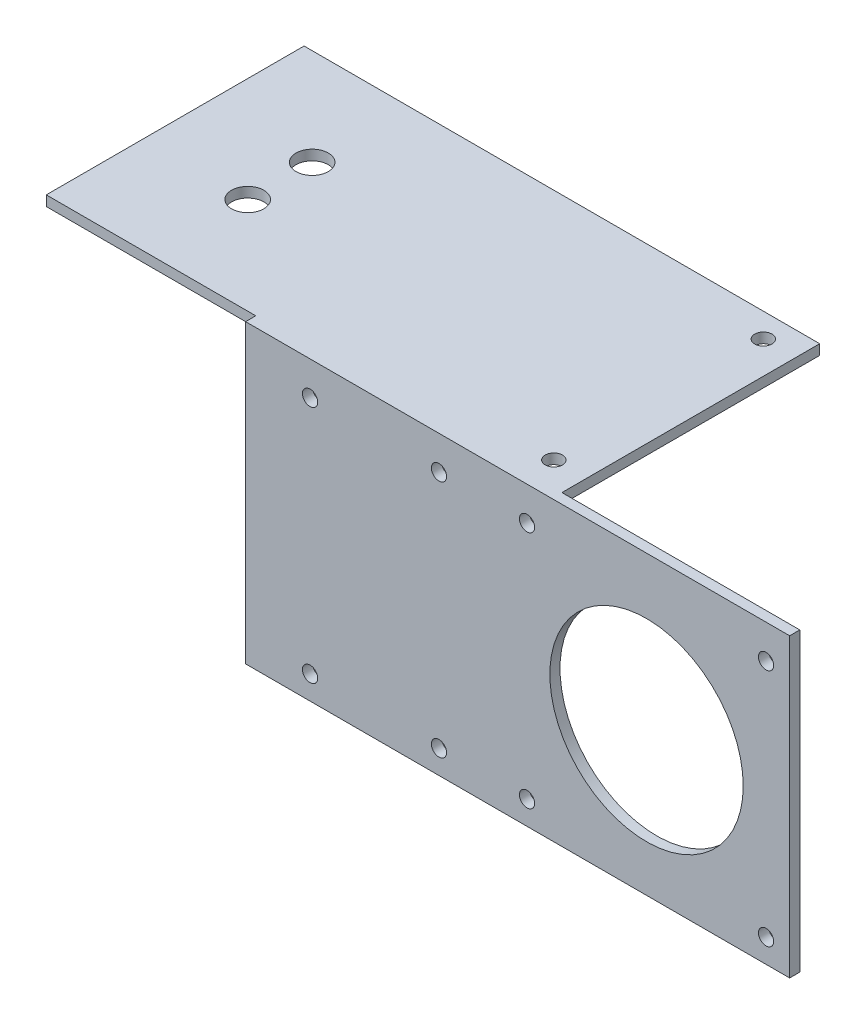
ISO-10303-21;
HEADER;
FILE_DESCRIPTION(('STEP AP214'),'2;1');
FILE_NAME('part.step','',(''),(''),'','','');
FILE_SCHEMA(('AUTOMOTIVE_DESIGN { 1 0 10303 214 1 1 1 1 }'));
ENDSEC;
DATA;
#1=APPLICATION_CONTEXT('core data for automotive mechanical design processes');
#2=APPLICATION_PROTOCOL_DEFINITION('international standard','automotive_design',2000,#1);
#3=PRODUCT_CONTEXT('',#1,'mechanical');
#4=PRODUCT('Part','Part','',(#3));
#5=PRODUCT_RELATED_PRODUCT_CATEGORY('part','',(#4));
#6=PRODUCT_DEFINITION_FORMATION('','',#4);
#7=PRODUCT_DEFINITION_CONTEXT('part definition',#1,'design');
#8=PRODUCT_DEFINITION('design','',#6,#7);
#9=PRODUCT_DEFINITION_SHAPE('','',#8);
#10=(LENGTH_UNIT() NAMED_UNIT(*) SI_UNIT(.MILLI.,.METRE.));
#11=(NAMED_UNIT(*) PLANE_ANGLE_UNIT() SI_UNIT($,.RADIAN.));
#12=(NAMED_UNIT(*) SI_UNIT($,.STERADIAN.) SOLID_ANGLE_UNIT());
#13=UNCERTAINTY_MEASURE_WITH_UNIT(LENGTH_MEASURE(1.E-05),#10,'distance_accuracy_value','');
#14=(GEOMETRIC_REPRESENTATION_CONTEXT(3) GLOBAL_UNCERTAINTY_ASSIGNED_CONTEXT((#13)) GLOBAL_UNIT_ASSIGNED_CONTEXT((#10,
#11,#12)) REPRESENTATION_CONTEXT('',''));
#15=CARTESIAN_POINT('',(0.,0.,0.));
#16=DIRECTION('',(0.,0.,1.));
#17=DIRECTION('',(1.,0.,0.));
#18=AXIS2_PLACEMENT_3D('',#15,#16,#17);
#19=CARTESIAN_POINT('',(0.,0.,-2.));
#20=DIRECTION('',(0.,0.,1.));
#21=DIRECTION('',(1.,0.,0.));
#22=AXIS2_PLACEMENT_3D('',#19,#20,#21);
#23=PLANE('',#22);
#24=CARTESIAN_POINT('',(102.55,51.75,-2.));
#25=DIRECTION('',(0.,0.,1.));
#26=DIRECTION('',(1.,0.,0.));
#27=AXIS2_PLACEMENT_3D('',#24,#25,#26);
#28=CIRCLE('',#27,1.5);
#29=CARTESIAN_POINT('',(104.05,51.75,-2.));
#30=VERTEX_POINT('',#29);
#31=EDGE_CURVE('E197',#30,#30,#28,.T.);
#32=ORIENTED_EDGE('',*,*,#31,.T.);
#33=EDGE_LOOP('',(#32));
#34=FACE_BOUND('',#33,.T.);
#35=CARTESIAN_POINT('',(102.55,4.64999999999999,-2.));
#36=DIRECTION('',(0.,0.,1.));
#37=DIRECTION('',(1.,0.,0.));
#38=AXIS2_PLACEMENT_3D('',#35,#36,#37);
#39=CIRCLE('',#38,1.5);
#40=CARTESIAN_POINT('',(104.05,4.64999999999999,-2.));
#41=VERTEX_POINT('',#40);
#42=EDGE_CURVE('E191',#41,#41,#39,.T.);
#43=ORIENTED_EDGE('',*,*,#42,.T.);
#44=EDGE_LOOP('',(#43));
#45=FACE_BOUND('',#44,.T.);
#46=CARTESIAN_POINT('',(55.45,4.64999999999999,-2.));
#47=DIRECTION('',(0.,0.,1.));
#48=DIRECTION('',(1.,0.,0.));
#49=AXIS2_PLACEMENT_3D('',#46,#47,#48);
#50=CIRCLE('',#49,1.5);
#51=CARTESIAN_POINT('',(56.95,4.64999999999999,-2.));
#52=VERTEX_POINT('',#51);
#53=EDGE_CURVE('E185',#52,#52,#50,.T.);
#54=ORIENTED_EDGE('',*,*,#53,.T.);
#55=EDGE_LOOP('',(#54));
#56=FACE_BOUND('',#55,.T.);
#57=CARTESIAN_POINT('',(55.45,51.75,-2.));
#58=DIRECTION('',(0.,0.,1.));
#59=DIRECTION('',(1.,0.,0.));
#60=AXIS2_PLACEMENT_3D('',#57,#58,#59);
#61=CIRCLE('',#60,1.5);
#62=CARTESIAN_POINT('',(56.95,51.75,-2.));
#63=VERTEX_POINT('',#62);
#64=EDGE_CURVE('E179',#63,#63,#61,.T.);
#65=ORIENTED_EDGE('',*,*,#64,.T.);
#66=EDGE_LOOP('',(#65));
#67=FACE_BOUND('',#66,.T.);
#68=CARTESIAN_POINT('',(12.7,51.75,-2.));
#69=DIRECTION('',(0.,0.,1.));
#70=DIRECTION('',(1.,0.,0.));
#71=AXIS2_PLACEMENT_3D('',#68,#69,#70);
#72=CIRCLE('',#71,1.5);
#73=CARTESIAN_POINT('',(14.2,51.75,-2.));
#74=VERTEX_POINT('',#73);
#75=EDGE_CURVE('E173',#74,#74,#72,.T.);
#76=ORIENTED_EDGE('',*,*,#75,.T.);
#77=EDGE_LOOP('',(#76));
#78=FACE_BOUND('',#77,.T.);
#79=CARTESIAN_POINT('',(38.1,51.75,-2.));
#80=DIRECTION('',(0.,0.,1.));
#81=DIRECTION('',(1.,0.,0.));
#82=AXIS2_PLACEMENT_3D('',#79,#80,#81);
#83=CIRCLE('',#82,1.5);
#84=CARTESIAN_POINT('',(39.6,51.75,-2.));
#85=VERTEX_POINT('',#84);
#86=EDGE_CURVE('E167',#85,#85,#83,.T.);
#87=ORIENTED_EDGE('',*,*,#86,.T.);
#88=EDGE_LOOP('',(#87));
#89=FACE_BOUND('',#88,.T.);
#90=CARTESIAN_POINT('',(12.7,4.64999999999999,-2.));
#91=DIRECTION('',(0.,0.,1.));
#92=DIRECTION('',(1.,0.,0.));
#93=AXIS2_PLACEMENT_3D('',#90,#91,#92);
#94=CIRCLE('',#93,1.5);
#95=CARTESIAN_POINT('',(14.2,4.64999999999999,-2.));
#96=VERTEX_POINT('',#95);
#97=EDGE_CURVE('E161',#96,#96,#94,.T.);
#98=ORIENTED_EDGE('',*,*,#97,.T.);
#99=EDGE_LOOP('',(#98));
#100=FACE_BOUND('',#99,.T.);
#101=CARTESIAN_POINT('',(38.1,4.64999999999999,-2.));
#102=DIRECTION('',(0.,0.,1.));
#103=DIRECTION('',(1.,0.,0.));
#104=AXIS2_PLACEMENT_3D('',#101,#102,#103);
#105=CIRCLE('',#104,1.5);
#106=CARTESIAN_POINT('',(39.6,4.64999999999999,-2.));
#107=VERTEX_POINT('',#106);
#108=EDGE_CURVE('E155',#107,#107,#105,.T.);
#109=ORIENTED_EDGE('',*,*,#108,.T.);
#110=EDGE_LOOP('',(#109));
#111=FACE_BOUND('',#110,.T.);
#112=CARTESIAN_POINT('',(79.,28.2,-2.));
#113=DIRECTION('',(0.,0.,1.));
#114=DIRECTION('',(1.,0.,0.));
#115=AXIS2_PLACEMENT_3D('',#112,#113,#114);
#116=CIRCLE('',#115,19.05);
#117=CARTESIAN_POINT('',(98.05,28.2,-2.));
#118=VERTEX_POINT('',#117);
#119=EDGE_CURVE('E149',#118,#118,#116,.T.);
#120=ORIENTED_EDGE('',*,*,#119,.T.);
#121=EDGE_LOOP('',(#120));
#122=FACE_BOUND('',#121,.T.);
#123=DIRECTION('',(-1.,0.,0.));
#124=VECTOR('',#123,1.);
#125=CARTESIAN_POINT('',(0.,56.4,-2.));
#126=LINE('',#125,#124);
#127=CARTESIAN_POINT('',(60.325,56.4,-2.));
#128=VERTEX_POINT('',#127);
#129=CARTESIAN_POINT('',(0.,56.4,-2.));
#130=VERTEX_POINT('',#129);
#131=EDGE_CURVE('E139',#128,#130,#126,.T.);
#132=ORIENTED_EDGE('',*,*,#131,.F.);
#133=DIRECTION('',(0.,-1.,0.));
#134=VECTOR('',#133,1.);
#135=CARTESIAN_POINT('',(60.325,56.4,-2.));
#136=LINE('',#135,#134);
#137=CARTESIAN_POINT('',(60.325,58.4,-2.));
#138=VERTEX_POINT('',#137);
#139=EDGE_CURVE('E50',#138,#128,#136,.T.);
#140=ORIENTED_EDGE('',*,*,#139,.F.);
#141=DIRECTION('',(-1.,0.,0.));
#142=VECTOR('',#141,1.);
#143=CARTESIAN_POINT('',(0.,58.4,-2.));
#144=LINE('',#143,#142);
#145=CARTESIAN_POINT('',(107.2,58.4,-2.));
#146=VERTEX_POINT('',#145);
#147=EDGE_CURVE('E118',#146,#138,#144,.T.);
#148=ORIENTED_EDGE('',*,*,#147,.F.);
#149=DIRECTION('',(0.,1.,0.));
#150=VECTOR('',#149,1.);
#151=CARTESIAN_POINT('',(107.2,58.4,-2.));
#152=LINE('',#151,#150);
#153=CARTESIAN_POINT('',(107.2,0.,-2.));
#154=VERTEX_POINT('',#153);
#155=EDGE_CURVE('E208',#154,#146,#152,.T.);
#156=ORIENTED_EDGE('',*,*,#155,.F.);
#157=DIRECTION('',(1.,0.,0.));
#158=VECTOR('',#157,1.);
#159=CARTESIAN_POINT('',(0.,0.,-2.));
#160=LINE('',#159,#158);
#161=CARTESIAN_POINT('',(0.,0.,-2.));
#162=VERTEX_POINT('',#161);
#163=EDGE_CURVE('E205',#162,#154,#160,.T.);
#164=ORIENTED_EDGE('',*,*,#163,.F.);
#165=DIRECTION('',(0.,-1.,0.));
#166=VECTOR('',#165,1.);
#167=CARTESIAN_POINT('',(0.,58.4,-2.));
#168=LINE('',#167,#166);
#169=EDGE_CURVE('E56',#130,#162,#168,.T.);
#170=ORIENTED_EDGE('',*,*,#169,.F.);
#171=EDGE_LOOP('',(#132,#140,#148,#156,#164,#170));
#172=FACE_BOUND('',#171,.T.);
#173=ADVANCED_FACE('F33',(#34,#45,#56,#67,#78,#89,#100,#111,#122,#172),#23,.F.);
#174=CARTESIAN_POINT('',(0.,58.4,-2.));
#175=DIRECTION('',(-1.,0.,0.));
#176=DIRECTION('',(0.,0.,1.));
#177=AXIS2_PLACEMENT_3D('',#174,#175,#176);
#178=PLANE('',#177);
#179=DIRECTION('',(0.,-1.,0.));
#180=VECTOR('',#179,1.);
#181=CARTESIAN_POINT('',(0.,58.4,0.));
#182=LINE('',#181,#180);
#183=CARTESIAN_POINT('',(0.,58.4,0.));
#184=VERTEX_POINT('',#183);
#185=CARTESIAN_POINT('',(0.,0.,0.));
#186=VERTEX_POINT('',#185);
#187=EDGE_CURVE('E200',#184,#186,#182,.T.);
#188=ORIENTED_EDGE('',*,*,#187,.F.);
#189=DIRECTION('',(0.,0.,1.));
#190=VECTOR('',#189,1.);
#191=CARTESIAN_POINT('',(0.,58.4,-2.));
#192=LINE('',#191,#190);
#193=CARTESIAN_POINT('',(0.,58.4,-2.));
#194=VERTEX_POINT('',#193);
#195=EDGE_CURVE('E11',#194,#184,#192,.T.);
#196=ORIENTED_EDGE('',*,*,#195,.F.);
#197=EDGE_CURVE('E203',#194,#130,#168,.T.);
#198=ORIENTED_EDGE('',*,*,#197,.T.);
#199=ORIENTED_EDGE('',*,*,#169,.T.);
#200=DIRECTION('',(0.,0.,1.));
#201=VECTOR('',#200,1.);
#202=CARTESIAN_POINT('',(0.,0.,-2.));
#203=LINE('',#202,#201);
#204=EDGE_CURVE('E212',#162,#186,#203,.T.);
#205=ORIENTED_EDGE('',*,*,#204,.T.);
#206=EDGE_LOOP('',(#188,#196,#198,#199,#205));
#207=FACE_BOUND('',#206,.T.);
#208=ADVANCED_FACE('F35',(#207),#178,.T.);
#209=CARTESIAN_POINT('',(0.,58.4,-2.));
#210=DIRECTION('',(0.,1.,0.));
#211=DIRECTION('',(-1.,0.,0.));
#212=AXIS2_PLACEMENT_3D('',#209,#210,#211);
#213=PLANE('',#212);
#214=CARTESIAN_POINT('',(53.975,58.4,-6.7625));
#215=DIRECTION('',(0.,1.,0.));
#216=DIRECTION('',(-1.,0.,0.));
#217=AXIS2_PLACEMENT_3D('',#214,#215,#216);
#218=CIRCLE('',#217,1.7);
#219=CARTESIAN_POINT('',(52.275,58.4,-6.7625));
#220=VERTEX_POINT('',#219);
#221=EDGE_CURVE('E234',#220,#220,#218,.T.);
#222=ORIENTED_EDGE('',*,*,#221,.F.);
#223=EDGE_LOOP('',(#222));
#224=FACE_BOUND('',#223,.T.);
#225=CARTESIAN_POINT('',(-20.6375,58.4,-33.75));
#226=DIRECTION('',(0.,1.,0.));
#227=DIRECTION('',(-1.,0.,0.));
#228=AXIS2_PLACEMENT_3D('',#225,#226,#227);
#229=CIRCLE('',#228,3.175);
#230=CARTESIAN_POINT('',(-23.8125,58.4,-33.75));
#231=VERTEX_POINT('',#230);
#232=EDGE_CURVE('E248',#231,#231,#229,.T.);
#233=ORIENTED_EDGE('',*,*,#232,.F.);
#234=EDGE_LOOP('',(#233));
#235=FACE_BOUND('',#234,.T.);
#236=CARTESIAN_POINT('',(-20.6375,58.4,-21.05));
#237=DIRECTION('',(0.,1.,0.));
#238=DIRECTION('',(-1.,0.,0.));
#239=AXIS2_PLACEMENT_3D('',#236,#237,#238);
#240=CIRCLE('',#239,3.175);
#241=CARTESIAN_POINT('',(-23.8125,58.4,-21.05));
#242=VERTEX_POINT('',#241);
#243=EDGE_CURVE('E245',#242,#242,#240,.T.);
#244=ORIENTED_EDGE('',*,*,#243,.F.);
#245=EDGE_LOOP('',(#244));
#246=FACE_BOUND('',#245,.T.);
#247=CARTESIAN_POINT('',(53.975,58.4,-48.0375));
#248=DIRECTION('',(0.,1.,0.));
#249=DIRECTION('',(-1.,0.,0.));
#250=AXIS2_PLACEMENT_3D('',#247,#248,#249);
#251=CIRCLE('',#250,1.7);
#252=CARTESIAN_POINT('',(52.275,58.4,-48.0375));
#253=VERTEX_POINT('',#252);
#254=EDGE_CURVE('E230',#253,#253,#251,.T.);
#255=ORIENTED_EDGE('',*,*,#254,.F.);
#256=EDGE_LOOP('',(#255));
#257=FACE_BOUND('',#256,.T.);
#258=DIRECTION('',(-1.,0.,0.));
#259=VECTOR('',#258,1.);
#260=CARTESIAN_POINT('',(0.,58.4,0.));
#261=LINE('',#260,#259);
#262=CARTESIAN_POINT('',(107.2,58.4,0.));
#263=VERTEX_POINT('',#262);
#264=EDGE_CURVE('E221',#263,#184,#261,.T.);
#265=ORIENTED_EDGE('',*,*,#264,.F.);
#266=DIRECTION('',(0.,0.,1.));
#267=VECTOR('',#266,1.);
#268=CARTESIAN_POINT('',(107.2,58.4,-2.));
#269=LINE('',#268,#267);
#270=EDGE_CURVE('E42',#146,#263,#269,.T.);
#271=ORIENTED_EDGE('',*,*,#270,.F.);
#272=ORIENTED_EDGE('',*,*,#147,.T.);
#273=DIRECTION('',(0.,0.,1.));
#274=VECTOR('',#273,1.);
#275=CARTESIAN_POINT('',(60.325,58.4,-52.8));
#276=LINE('',#275,#274);
#277=CARTESIAN_POINT('',(60.325,58.4,-52.8));
#278=VERTEX_POINT('',#277);
#279=EDGE_CURVE('E115',#278,#138,#276,.T.);
#280=ORIENTED_EDGE('',*,*,#279,.F.);
#281=DIRECTION('',(1.,0.,0.));
#282=VECTOR('',#281,1.);
#283=CARTESIAN_POINT('',(-41.275,58.4,-52.8));
#284=LINE('',#283,#282);
#285=CARTESIAN_POINT('',(-41.275,58.4,-52.8));
#286=VERTEX_POINT('',#285);
#287=EDGE_CURVE('E101',#286,#278,#284,.T.);
#288=ORIENTED_EDGE('',*,*,#287,.F.);
#289=DIRECTION('',(0.,0.,1.));
#290=VECTOR('',#289,1.);
#291=CARTESIAN_POINT('',(-41.275,58.4,-52.8));
#292=LINE('',#291,#290);
#293=CARTESIAN_POINT('',(-41.275,58.4,-2.));
#294=VERTEX_POINT('',#293);
#295=EDGE_CURVE('E132',#286,#294,#292,.T.);
#296=ORIENTED_EDGE('',*,*,#295,.T.);
#297=DIRECTION('',(1.,0.,0.));
#298=VECTOR('',#297,1.);
#299=CARTESIAN_POINT('',(60.325,58.4,-2.));
#300=LINE('',#299,#298);
#301=EDGE_CURVE('E133',#294,#194,#300,.T.);
#302=ORIENTED_EDGE('',*,*,#301,.T.);
#303=ORIENTED_EDGE('',*,*,#195,.T.);
#304=EDGE_LOOP('',(#265,#271,#272,#280,#288,#296,#302,#303));
#305=FACE_BOUND('',#304,.T.);
#306=ADVANCED_FACE('F117',(#224,#235,#246,#257,#305),#213,.T.);
#307=CARTESIAN_POINT('',(107.2,58.4,-2.));
#308=DIRECTION('',(1.,0.,0.));
#309=DIRECTION('',(0.,0.,-1.));
#310=AXIS2_PLACEMENT_3D('',#307,#308,#309);
#311=PLANE('',#310);
#312=DIRECTION('',(0.,1.,0.));
#313=VECTOR('',#312,1.);
#314=CARTESIAN_POINT('',(107.2,58.4,0.));
#315=LINE('',#314,#313);
#316=CARTESIAN_POINT('',(107.2,0.,0.));
#317=VERTEX_POINT('',#316);
#318=EDGE_CURVE('E218',#317,#263,#315,.T.);
#319=ORIENTED_EDGE('',*,*,#318,.F.);
#320=DIRECTION('',(0.,0.,1.));
#321=VECTOR('',#320,1.);
#322=CARTESIAN_POINT('',(107.2,0.,-2.));
#323=LINE('',#322,#321);
#324=EDGE_CURVE('E225',#154,#317,#323,.T.);
#325=ORIENTED_EDGE('',*,*,#324,.F.);
#326=ORIENTED_EDGE('',*,*,#155,.T.);
#327=ORIENTED_EDGE('',*,*,#270,.T.);
#328=EDGE_LOOP('',(#319,#325,#326,#327));
#329=FACE_BOUND('',#328,.T.);
#330=ADVANCED_FACE('F259',(#329),#311,.T.);
#331=CARTESIAN_POINT('',(0.,0.,-2.));
#332=DIRECTION('',(0.,-1.,0.));
#333=DIRECTION('',(0.,0.,-1.));
#334=AXIS2_PLACEMENT_3D('',#331,#332,#333);
#335=PLANE('',#334);
#336=DIRECTION('',(1.,0.,0.));
#337=VECTOR('',#336,1.);
#338=CARTESIAN_POINT('',(0.,0.,0.));
#339=LINE('',#338,#337);
#340=EDGE_CURVE('E215',#186,#317,#339,.T.);
#341=ORIENTED_EDGE('',*,*,#340,.F.);
#342=ORIENTED_EDGE('',*,*,#204,.F.);
#343=ORIENTED_EDGE('',*,*,#163,.T.);
#344=ORIENTED_EDGE('',*,*,#324,.T.);
#345=EDGE_LOOP('',(#341,#342,#343,#344));
#346=FACE_BOUND('',#345,.T.);
#347=ADVANCED_FACE('F297',(#346),#335,.T.);
#348=CARTESIAN_POINT('',(0.,0.,0.));
#349=DIRECTION('',(0.,0.,1.));
#350=DIRECTION('',(1.,0.,0.));
#351=AXIS2_PLACEMENT_3D('',#348,#349,#350);
#352=PLANE('',#351);
#353=CARTESIAN_POINT('',(79.,28.2,0.));
#354=DIRECTION('',(0.,0.,1.));
#355=DIRECTION('',(1.,0.,0.));
#356=AXIS2_PLACEMENT_3D('',#353,#354,#355);
#357=CIRCLE('',#356,19.05);
#358=CARTESIAN_POINT('',(98.05,28.2,0.));
#359=VERTEX_POINT('',#358);
#360=EDGE_CURVE('E120',#359,#359,#357,.T.);
#361=ORIENTED_EDGE('',*,*,#360,.F.);
#362=EDGE_LOOP('',(#361));
#363=FACE_BOUND('',#362,.T.);
#364=CARTESIAN_POINT('',(38.1,4.64999999999999,0.));
#365=DIRECTION('',(0.,0.,1.));
#366=DIRECTION('',(1.,0.,0.));
#367=AXIS2_PLACEMENT_3D('',#364,#365,#366);
#368=CIRCLE('',#367,1.5);
#369=CARTESIAN_POINT('',(39.6,4.64999999999999,0.));
#370=VERTEX_POINT('',#369);
#371=EDGE_CURVE('E152',#370,#370,#368,.T.);
#372=ORIENTED_EDGE('',*,*,#371,.F.);
#373=EDGE_LOOP('',(#372));
#374=FACE_BOUND('',#373,.T.);
#375=CARTESIAN_POINT('',(12.7,4.64999999999999,0.));
#376=DIRECTION('',(0.,0.,1.));
#377=DIRECTION('',(1.,0.,0.));
#378=AXIS2_PLACEMENT_3D('',#375,#376,#377);
#379=CIRCLE('',#378,1.5);
#380=CARTESIAN_POINT('',(14.2,4.64999999999999,0.));
#381=VERTEX_POINT('',#380);
#382=EDGE_CURVE('E158',#381,#381,#379,.T.);
#383=ORIENTED_EDGE('',*,*,#382,.F.);
#384=EDGE_LOOP('',(#383));
#385=FACE_BOUND('',#384,.T.);
#386=CARTESIAN_POINT('',(38.1,51.75,0.));
#387=DIRECTION('',(0.,0.,1.));
#388=DIRECTION('',(1.,0.,0.));
#389=AXIS2_PLACEMENT_3D('',#386,#387,#388);
#390=CIRCLE('',#389,1.5);
#391=CARTESIAN_POINT('',(39.6,51.75,0.));
#392=VERTEX_POINT('',#391);
#393=EDGE_CURVE('E164',#392,#392,#390,.T.);
#394=ORIENTED_EDGE('',*,*,#393,.F.);
#395=EDGE_LOOP('',(#394));
#396=FACE_BOUND('',#395,.T.);
#397=CARTESIAN_POINT('',(12.7,51.75,0.));
#398=DIRECTION('',(0.,0.,1.));
#399=DIRECTION('',(1.,0.,0.));
#400=AXIS2_PLACEMENT_3D('',#397,#398,#399);
#401=CIRCLE('',#400,1.5);
#402=CARTESIAN_POINT('',(14.2,51.75,0.));
#403=VERTEX_POINT('',#402);
#404=EDGE_CURVE('E170',#403,#403,#401,.T.);
#405=ORIENTED_EDGE('',*,*,#404,.F.);
#406=EDGE_LOOP('',(#405));
#407=FACE_BOUND('',#406,.T.);
#408=CARTESIAN_POINT('',(55.45,51.75,0.));
#409=DIRECTION('',(0.,0.,1.));
#410=DIRECTION('',(1.,0.,0.));
#411=AXIS2_PLACEMENT_3D('',#408,#409,#410);
#412=CIRCLE('',#411,1.5);
#413=CARTESIAN_POINT('',(56.95,51.75,0.));
#414=VERTEX_POINT('',#413);
#415=EDGE_CURVE('E176',#414,#414,#412,.T.);
#416=ORIENTED_EDGE('',*,*,#415,.F.);
#417=EDGE_LOOP('',(#416));
#418=FACE_BOUND('',#417,.T.);
#419=CARTESIAN_POINT('',(55.45,4.64999999999999,0.));
#420=DIRECTION('',(0.,0.,1.));
#421=DIRECTION('',(1.,0.,0.));
#422=AXIS2_PLACEMENT_3D('',#419,#420,#421);
#423=CIRCLE('',#422,1.5);
#424=CARTESIAN_POINT('',(56.95,4.64999999999999,0.));
#425=VERTEX_POINT('',#424);
#426=EDGE_CURVE('E182',#425,#425,#423,.T.);
#427=ORIENTED_EDGE('',*,*,#426,.F.);
#428=EDGE_LOOP('',(#427));
#429=FACE_BOUND('',#428,.T.);
#430=CARTESIAN_POINT('',(102.55,4.64999999999999,0.));
#431=DIRECTION('',(0.,0.,1.));
#432=DIRECTION('',(1.,0.,0.));
#433=AXIS2_PLACEMENT_3D('',#430,#431,#432);
#434=CIRCLE('',#433,1.5);
#435=CARTESIAN_POINT('',(104.05,4.64999999999999,0.));
#436=VERTEX_POINT('',#435);
#437=EDGE_CURVE('E188',#436,#436,#434,.T.);
#438=ORIENTED_EDGE('',*,*,#437,.F.);
#439=EDGE_LOOP('',(#438));
#440=FACE_BOUND('',#439,.T.);
#441=CARTESIAN_POINT('',(102.55,51.75,0.));
#442=DIRECTION('',(0.,0.,1.));
#443=DIRECTION('',(1.,0.,0.));
#444=AXIS2_PLACEMENT_3D('',#441,#442,#443);
#445=CIRCLE('',#444,1.5);
#446=CARTESIAN_POINT('',(104.05,51.75,0.));
#447=VERTEX_POINT('',#446);
#448=EDGE_CURVE('E194',#447,#447,#445,.T.);
#449=ORIENTED_EDGE('',*,*,#448,.F.);
#450=EDGE_LOOP('',(#449));
#451=FACE_BOUND('',#450,.T.);
#452=ORIENTED_EDGE('',*,*,#187,.T.);
#453=ORIENTED_EDGE('',*,*,#340,.T.);
#454=ORIENTED_EDGE('',*,*,#318,.T.);
#455=ORIENTED_EDGE('',*,*,#264,.T.);
#456=EDGE_LOOP('',(#452,#453,#454,#455));
#457=FACE_BOUND('',#456,.T.);
#458=ADVANCED_FACE('F295',(#363,#374,#385,#396,#407,#418,#429,#440,#451,#457),#352,.T.);
#459=CARTESIAN_POINT('',(102.55,51.75,-2.));
#460=DIRECTION('',(0.,0.,1.));
#461=DIRECTION('',(1.,0.,0.));
#462=AXIS2_PLACEMENT_3D('',#459,#460,#461);
#463=CYLINDRICAL_SURFACE('',#462,1.5);
#464=ORIENTED_EDGE('',*,*,#31,.F.);
#465=EDGE_LOOP('',(#464));
#466=FACE_BOUND('',#465,.T.);
#467=ORIENTED_EDGE('',*,*,#448,.T.);
#468=EDGE_LOOP('',(#467));
#469=FACE_BOUND('',#468,.T.);
#470=ADVANCED_FACE('F293',(#466,#469),#463,.F.);
#471=CARTESIAN_POINT('',(102.55,4.64999999999999,-2.));
#472=DIRECTION('',(0.,0.,1.));
#473=DIRECTION('',(1.,0.,0.));
#474=AXIS2_PLACEMENT_3D('',#471,#472,#473);
#475=CYLINDRICAL_SURFACE('',#474,1.5);
#476=ORIENTED_EDGE('',*,*,#42,.F.);
#477=EDGE_LOOP('',(#476));
#478=FACE_BOUND('',#477,.T.);
#479=ORIENTED_EDGE('',*,*,#437,.T.);
#480=EDGE_LOOP('',(#479));
#481=FACE_BOUND('',#480,.T.);
#482=ADVANCED_FACE('F353',(#478,#481),#475,.F.);
#483=CARTESIAN_POINT('',(55.45,4.64999999999999,-2.));
#484=DIRECTION('',(0.,0.,1.));
#485=DIRECTION('',(1.,0.,0.));
#486=AXIS2_PLACEMENT_3D('',#483,#484,#485);
#487=CYLINDRICAL_SURFACE('',#486,1.5);
#488=ORIENTED_EDGE('',*,*,#53,.F.);
#489=EDGE_LOOP('',(#488));
#490=FACE_BOUND('',#489,.T.);
#491=ORIENTED_EDGE('',*,*,#426,.T.);
#492=EDGE_LOOP('',(#491));
#493=FACE_BOUND('',#492,.T.);
#494=ADVANCED_FACE('F350',(#490,#493),#487,.F.);
#495=CARTESIAN_POINT('',(55.45,51.75,-2.));
#496=DIRECTION('',(0.,0.,1.));
#497=DIRECTION('',(1.,0.,0.));
#498=AXIS2_PLACEMENT_3D('',#495,#496,#497);
#499=CYLINDRICAL_SURFACE('',#498,1.5);
#500=ORIENTED_EDGE('',*,*,#64,.F.);
#501=EDGE_LOOP('',(#500));
#502=FACE_BOUND('',#501,.T.);
#503=ORIENTED_EDGE('',*,*,#415,.T.);
#504=EDGE_LOOP('',(#503));
#505=FACE_BOUND('',#504,.T.);
#506=ADVANCED_FACE('F346',(#502,#505),#499,.F.);
#507=CARTESIAN_POINT('',(12.7,51.75,-2.));
#508=DIRECTION('',(0.,0.,1.));
#509=DIRECTION('',(1.,0.,0.));
#510=AXIS2_PLACEMENT_3D('',#507,#508,#509);
#511=CYLINDRICAL_SURFACE('',#510,1.5);
#512=ORIENTED_EDGE('',*,*,#75,.F.);
#513=EDGE_LOOP('',(#512));
#514=FACE_BOUND('',#513,.T.);
#515=ORIENTED_EDGE('',*,*,#404,.T.);
#516=EDGE_LOOP('',(#515));
#517=FACE_BOUND('',#516,.T.);
#518=ADVANCED_FACE('F342',(#514,#517),#511,.F.);
#519=CARTESIAN_POINT('',(38.1,51.75,-2.));
#520=DIRECTION('',(0.,0.,1.));
#521=DIRECTION('',(1.,0.,0.));
#522=AXIS2_PLACEMENT_3D('',#519,#520,#521);
#523=CYLINDRICAL_SURFACE('',#522,1.5);
#524=ORIENTED_EDGE('',*,*,#86,.F.);
#525=EDGE_LOOP('',(#524));
#526=FACE_BOUND('',#525,.T.);
#527=ORIENTED_EDGE('',*,*,#393,.T.);
#528=EDGE_LOOP('',(#527));
#529=FACE_BOUND('',#528,.T.);
#530=ADVANCED_FACE('F338',(#526,#529),#523,.F.);
#531=CARTESIAN_POINT('',(12.7,4.64999999999999,-2.));
#532=DIRECTION('',(0.,0.,1.));
#533=DIRECTION('',(1.,0.,0.));
#534=AXIS2_PLACEMENT_3D('',#531,#532,#533);
#535=CYLINDRICAL_SURFACE('',#534,1.5);
#536=ORIENTED_EDGE('',*,*,#97,.F.);
#537=EDGE_LOOP('',(#536));
#538=FACE_BOUND('',#537,.T.);
#539=ORIENTED_EDGE('',*,*,#382,.T.);
#540=EDGE_LOOP('',(#539));
#541=FACE_BOUND('',#540,.T.);
#542=ADVANCED_FACE('F334',(#538,#541),#535,.F.);
#543=CARTESIAN_POINT('',(38.1,4.64999999999999,-2.));
#544=DIRECTION('',(0.,0.,1.));
#545=DIRECTION('',(1.,0.,0.));
#546=AXIS2_PLACEMENT_3D('',#543,#544,#545);
#547=CYLINDRICAL_SURFACE('',#546,1.5);
#548=ORIENTED_EDGE('',*,*,#108,.F.);
#549=EDGE_LOOP('',(#548));
#550=FACE_BOUND('',#549,.T.);
#551=ORIENTED_EDGE('',*,*,#371,.T.);
#552=EDGE_LOOP('',(#551));
#553=FACE_BOUND('',#552,.T.);
#554=ADVANCED_FACE('F330',(#550,#553),#547,.F.);
#555=CARTESIAN_POINT('',(79.,28.2,-2.));
#556=DIRECTION('',(0.,0.,1.));
#557=DIRECTION('',(1.,0.,0.));
#558=AXIS2_PLACEMENT_3D('',#555,#556,#557);
#559=CYLINDRICAL_SURFACE('',#558,19.05);
#560=ORIENTED_EDGE('',*,*,#119,.F.);
#561=EDGE_LOOP('',(#560));
#562=FACE_BOUND('',#561,.T.);
#563=ORIENTED_EDGE('',*,*,#360,.T.);
#564=EDGE_LOOP('',(#563));
#565=FACE_BOUND('',#564,.T.);
#566=ADVANCED_FACE('F327',(#562,#565),#559,.F.);
#567=CARTESIAN_POINT('',(0.,0.,-2.));
#568=DIRECTION('',(0.,0.,1.));
#569=DIRECTION('',(1.,0.,0.));
#570=AXIS2_PLACEMENT_3D('',#567,#568,#569);
#571=PLANE('',#570);
#572=ORIENTED_EDGE('',*,*,#197,.F.);
#573=ORIENTED_EDGE('',*,*,#301,.F.);
#574=DIRECTION('',(0.,1.,0.));
#575=VECTOR('',#574,1.);
#576=CARTESIAN_POINT('',(-41.275,56.4,-2.));
#577=LINE('',#576,#575);
#578=CARTESIAN_POINT('',(-41.275,56.4,-2.));
#579=VERTEX_POINT('',#578);
#580=EDGE_CURVE('E112',#579,#294,#577,.T.);
#581=ORIENTED_EDGE('',*,*,#580,.F.);
#582=EDGE_CURVE('E138',#130,#579,#126,.T.);
#583=ORIENTED_EDGE('',*,*,#582,.F.);
#584=EDGE_LOOP('',(#572,#573,#581,#583));
#585=FACE_BOUND('',#584,.T.);
#586=ADVANCED_FACE('F314',(#585),#571,.T.);
#587=CARTESIAN_POINT('',(60.325,56.4,-52.8));
#588=DIRECTION('',(-1.,0.,0.));
#589=DIRECTION('',(0.,0.,1.));
#590=AXIS2_PLACEMENT_3D('',#587,#588,#589);
#591=PLANE('',#590);
#592=ORIENTED_EDGE('',*,*,#139,.T.);
#593=DIRECTION('',(0.,0.,1.));
#594=VECTOR('',#593,1.);
#595=CARTESIAN_POINT('',(60.325,56.4,-52.8));
#596=LINE('',#595,#594);
#597=CARTESIAN_POINT('',(60.325,56.4,-52.8));
#598=VERTEX_POINT('',#597);
#599=EDGE_CURVE('E121',#598,#128,#596,.T.);
#600=ORIENTED_EDGE('',*,*,#599,.F.);
#601=DIRECTION('',(0.,-1.,0.));
#602=VECTOR('',#601,1.);
#603=CARTESIAN_POINT('',(60.325,56.4,-52.8));
#604=LINE('',#603,#602);
#605=EDGE_CURVE('E105',#278,#598,#604,.T.);
#606=ORIENTED_EDGE('',*,*,#605,.F.);
#607=ORIENTED_EDGE('',*,*,#279,.T.);
#608=EDGE_LOOP('',(#592,#600,#606,#607));
#609=FACE_BOUND('',#608,.T.);
#610=ADVANCED_FACE('F123',(#609),#591,.F.);
#611=CARTESIAN_POINT('',(0.,56.4,-52.8));
#612=DIRECTION('',(0.,1.,0.));
#613=DIRECTION('',(0.,0.,1.));
#614=AXIS2_PLACEMENT_3D('',#611,#612,#613);
#615=PLANE('',#614);
#616=CARTESIAN_POINT('',(53.975,56.4,-6.7625));
#617=DIRECTION('',(0.,1.,0.));
#618=DIRECTION('',(0.,0.,1.));
#619=AXIS2_PLACEMENT_3D('',#616,#617,#618);
#620=CIRCLE('',#619,1.7);
#621=CARTESIAN_POINT('',(53.975,56.4,-5.0625));
#622=VERTEX_POINT('',#621);
#623=EDGE_CURVE('E37',#622,#622,#620,.T.);
#624=ORIENTED_EDGE('',*,*,#623,.T.);
#625=EDGE_LOOP('',(#624));
#626=FACE_BOUND('',#625,.T.);
#627=CARTESIAN_POINT('',(-20.6375,56.4,-33.75));
#628=DIRECTION('',(0.,1.,0.));
#629=DIRECTION('',(0.,0.,1.));
#630=AXIS2_PLACEMENT_3D('',#627,#628,#629);
#631=CIRCLE('',#630,3.175);
#632=CARTESIAN_POINT('',(-20.6375,56.4,-30.575));
#633=VERTEX_POINT('',#632);
#634=EDGE_CURVE('E233',#633,#633,#631,.T.);
#635=ORIENTED_EDGE('',*,*,#634,.T.);
#636=EDGE_LOOP('',(#635));
#637=FACE_BOUND('',#636,.T.);
#638=CARTESIAN_POINT('',(-20.6375,56.4,-21.05));
#639=DIRECTION('',(0.,1.,0.));
#640=DIRECTION('',(0.,0.,1.));
#641=AXIS2_PLACEMENT_3D('',#638,#639,#640);
#642=CIRCLE('',#641,3.175);
#643=CARTESIAN_POINT('',(-20.6375,56.4,-17.875));
#644=VERTEX_POINT('',#643);
#645=EDGE_CURVE('E231',#644,#644,#642,.T.);
#646=ORIENTED_EDGE('',*,*,#645,.T.);
#647=EDGE_LOOP('',(#646));
#648=FACE_BOUND('',#647,.T.);
#649=CARTESIAN_POINT('',(53.975,56.4,-48.0375));
#650=DIRECTION('',(0.,1.,0.));
#651=DIRECTION('',(0.,0.,1.));
#652=AXIS2_PLACEMENT_3D('',#649,#650,#651);
#653=CIRCLE('',#652,1.7);
#654=CARTESIAN_POINT('',(53.975,56.4,-46.3375));
#655=VERTEX_POINT('',#654);
#656=EDGE_CURVE('E136',#655,#655,#653,.T.);
#657=ORIENTED_EDGE('',*,*,#656,.T.);
#658=EDGE_LOOP('',(#657));
#659=FACE_BOUND('',#658,.T.);
#660=ORIENTED_EDGE('',*,*,#131,.T.);
#661=ORIENTED_EDGE('',*,*,#582,.T.);
#662=DIRECTION('',(0.,0.,1.));
#663=VECTOR('',#662,1.);
#664=CARTESIAN_POINT('',(-41.275,56.4,-52.8));
#665=LINE('',#664,#663);
#666=CARTESIAN_POINT('',(-41.275,56.4,-52.8));
#667=VERTEX_POINT('',#666);
#668=EDGE_CURVE('E145',#667,#579,#665,.T.);
#669=ORIENTED_EDGE('',*,*,#668,.F.);
#670=DIRECTION('',(-1.,0.,0.));
#671=VECTOR('',#670,1.);
#672=CARTESIAN_POINT('',(0.,56.4,-52.8));
#673=LINE('',#672,#671);
#674=EDGE_CURVE('E126',#598,#667,#673,.T.);
#675=ORIENTED_EDGE('',*,*,#674,.F.);
#676=ORIENTED_EDGE('',*,*,#599,.T.);
#677=EDGE_LOOP('',(#660,#661,#669,#675,#676));
#678=FACE_BOUND('',#677,.T.);
#679=ADVANCED_FACE('F274',(#626,#637,#648,#659,#678),#615,.F.);
#680=CARTESIAN_POINT('',(-41.275,56.4,-52.8));
#681=DIRECTION('',(1.,0.,0.));
#682=DIRECTION('',(0.,0.,-1.));
#683=AXIS2_PLACEMENT_3D('',#680,#681,#682);
#684=PLANE('',#683);
#685=ORIENTED_EDGE('',*,*,#580,.T.);
#686=ORIENTED_EDGE('',*,*,#295,.F.);
#687=DIRECTION('',(0.,1.,0.));
#688=VECTOR('',#687,1.);
#689=CARTESIAN_POINT('',(-41.275,56.4,-52.8));
#690=LINE('',#689,#688);
#691=EDGE_CURVE('E108',#667,#286,#690,.T.);
#692=ORIENTED_EDGE('',*,*,#691,.F.);
#693=ORIENTED_EDGE('',*,*,#668,.T.);
#694=EDGE_LOOP('',(#685,#686,#692,#693));
#695=FACE_BOUND('',#694,.T.);
#696=ADVANCED_FACE('F277',(#695),#684,.F.);
#697=CARTESIAN_POINT('',(0.,0.,-52.8));
#698=DIRECTION('',(0.,0.,1.));
#699=DIRECTION('',(1.,0.,0.));
#700=AXIS2_PLACEMENT_3D('',#697,#698,#699);
#701=PLANE('',#700);
#702=ORIENTED_EDGE('',*,*,#287,.T.);
#703=ORIENTED_EDGE('',*,*,#605,.T.);
#704=ORIENTED_EDGE('',*,*,#674,.T.);
#705=ORIENTED_EDGE('',*,*,#691,.T.);
#706=EDGE_LOOP('',(#702,#703,#704,#705));
#707=FACE_BOUND('',#706,.T.);
#708=ADVANCED_FACE('F103',(#707),#701,.F.);
#709=CARTESIAN_POINT('',(53.975,0.,-48.0375));
#710=DIRECTION('',(0.,1.,0.));
#711=DIRECTION('',(-1.,0.,0.));
#712=AXIS2_PLACEMENT_3D('',#709,#710,#711);
#713=CYLINDRICAL_SURFACE('',#712,1.7);
#714=ORIENTED_EDGE('',*,*,#254,.T.);
#715=EDGE_LOOP('',(#714));
#716=FACE_BOUND('',#715,.T.);
#717=ORIENTED_EDGE('',*,*,#656,.F.);
#718=EDGE_LOOP('',(#717));
#719=FACE_BOUND('',#718,.T.);
#720=ADVANCED_FACE('F270',(#716,#719),#713,.F.);
#721=CARTESIAN_POINT('',(-20.6375,0.,-21.05));
#722=DIRECTION('',(0.,1.,0.));
#723=DIRECTION('',(-1.,0.,0.));
#724=AXIS2_PLACEMENT_3D('',#721,#722,#723);
#725=CYLINDRICAL_SURFACE('',#724,3.175);
#726=ORIENTED_EDGE('',*,*,#243,.T.);
#727=EDGE_LOOP('',(#726));
#728=FACE_BOUND('',#727,.T.);
#729=ORIENTED_EDGE('',*,*,#645,.F.);
#730=EDGE_LOOP('',(#729));
#731=FACE_BOUND('',#730,.T.);
#732=ADVANCED_FACE('F266',(#728,#731),#725,.F.);
#733=CARTESIAN_POINT('',(-20.6375,0.,-33.75));
#734=DIRECTION('',(0.,1.,0.));
#735=DIRECTION('',(-1.,0.,0.));
#736=AXIS2_PLACEMENT_3D('',#733,#734,#735);
#737=CYLINDRICAL_SURFACE('',#736,3.175);
#738=ORIENTED_EDGE('',*,*,#232,.T.);
#739=EDGE_LOOP('',(#738));
#740=FACE_BOUND('',#739,.T.);
#741=ORIENTED_EDGE('',*,*,#634,.F.);
#742=EDGE_LOOP('',(#741));
#743=FACE_BOUND('',#742,.T.);
#744=ADVANCED_FACE('F269',(#740,#743),#737,.F.);
#745=CARTESIAN_POINT('',(53.975,0.,-6.7625));
#746=DIRECTION('',(0.,1.,0.));
#747=DIRECTION('',(-1.,0.,0.));
#748=AXIS2_PLACEMENT_3D('',#745,#746,#747);
#749=CYLINDRICAL_SURFACE('',#748,1.7);
#750=ORIENTED_EDGE('',*,*,#221,.T.);
#751=EDGE_LOOP('',(#750));
#752=FACE_BOUND('',#751,.T.);
#753=ORIENTED_EDGE('',*,*,#623,.F.);
#754=EDGE_LOOP('',(#753));
#755=FACE_BOUND('',#754,.T.);
#756=ADVANCED_FACE('F254',(#752,#755),#749,.F.);
#757=CLOSED_SHELL('',(#173,#208,#306,#330,#347,#458,#470,#482,#494,#506,#518,#530,#542,#554,
#566,#586,#610,#679,#696,#708,#720,#732,#744,#756));
#758=MANIFOLD_SOLID_BREP('B2',#757);
#759=ADVANCED_BREP_SHAPE_REPRESENTATION('',(#18,#758),#14);
#760=SHAPE_DEFINITION_REPRESENTATION(#9,#759);
ENDSEC;
END-ISO-10303-21;
